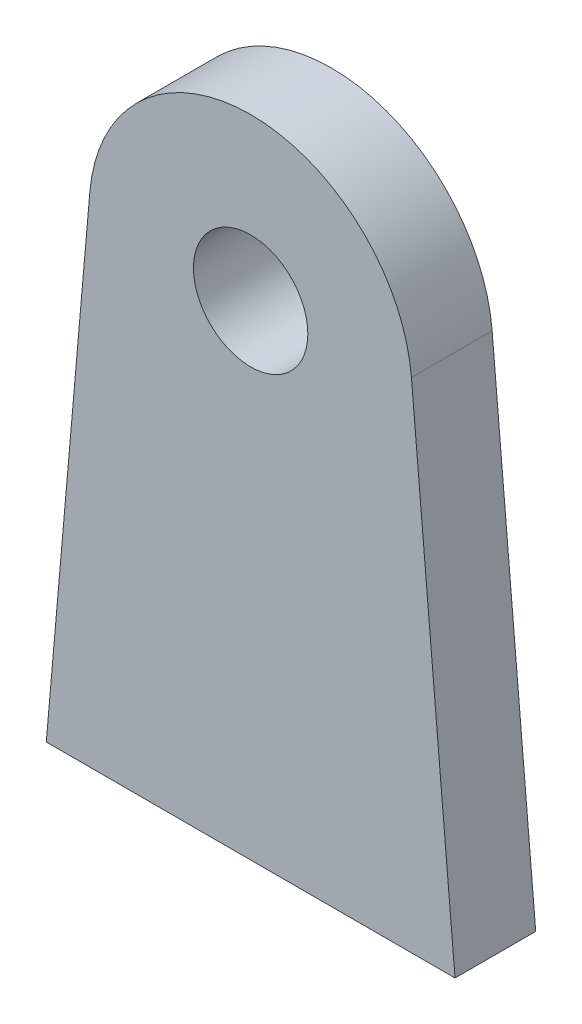
ISO-10303-21;
HEADER;
FILE_DESCRIPTION(('STEP AP214'),'2;1');
FILE_NAME('part.step','',(''),(''),'','','');
FILE_SCHEMA(('AUTOMOTIVE_DESIGN { 1 0 10303 214 1 1 1 1 }'));
ENDSEC;
DATA;
#1=APPLICATION_CONTEXT('core data for automotive mechanical design processes');
#2=APPLICATION_PROTOCOL_DEFINITION('international standard','automotive_design',2000,#1);
#3=PRODUCT_CONTEXT('',#1,'mechanical');
#4=PRODUCT('Part','Part','',(#3));
#5=PRODUCT_RELATED_PRODUCT_CATEGORY('part','',(#4));
#6=PRODUCT_DEFINITION_FORMATION('','',#4);
#7=PRODUCT_DEFINITION_CONTEXT('part definition',#1,'design');
#8=PRODUCT_DEFINITION('design','',#6,#7);
#9=PRODUCT_DEFINITION_SHAPE('','',#8);
#10=(LENGTH_UNIT() NAMED_UNIT(*) SI_UNIT(.MILLI.,.METRE.));
#11=(NAMED_UNIT(*) PLANE_ANGLE_UNIT() SI_UNIT($,.RADIAN.));
#12=(NAMED_UNIT(*) SI_UNIT($,.STERADIAN.) SOLID_ANGLE_UNIT());
#13=UNCERTAINTY_MEASURE_WITH_UNIT(LENGTH_MEASURE(1.E-05),#10,'distance_accuracy_value','');
#14=(GEOMETRIC_REPRESENTATION_CONTEXT(3) GLOBAL_UNCERTAINTY_ASSIGNED_CONTEXT((#13)) GLOBAL_UNIT_ASSIGNED_CONTEXT((#10,
#11,#12)) REPRESENTATION_CONTEXT('',''));
#15=CARTESIAN_POINT('',(0.,0.,0.));
#16=DIRECTION('',(0.,0.,1.));
#17=DIRECTION('',(1.,0.,0.));
#18=AXIS2_PLACEMENT_3D('',#15,#16,#17);
#19=CARTESIAN_POINT('',(0.,0.,3.175));
#20=DIRECTION('',(0.996194698091746,-0.0871557427476583,0.));
#21=DIRECTION('',(0.0871557427476583,0.996194698091746,0.));
#22=AXIS2_PLACEMENT_3D('',#19,#20,#21);
#23=PLANE('',#22);
#24=DIRECTION('',(-0.0871557427476583,-0.996194698091746,0.));
#25=VECTOR('',#24,1.);
#26=CARTESIAN_POINT('',(0.,0.,0.));
#27=LINE('',#26,#25);
#28=CARTESIAN_POINT('',(1.71507867568653,19.6034389664476,0.));
#29=VERTEX_POINT('',#28);
#30=CARTESIAN_POINT('',(0.,0.,0.));
#31=VERTEX_POINT('',#30);
#32=EDGE_CURVE('E99',#29,#31,#27,.T.);
#33=ORIENTED_EDGE('',*,*,#32,.T.);
#34=DIRECTION('',(0.,0.,-1.));
#35=VECTOR('',#34,1.);
#36=CARTESIAN_POINT('',(0.,0.,3.175));
#37=LINE('',#36,#35);
#38=CARTESIAN_POINT('',(0.,0.,3.175));
#39=VERTEX_POINT('',#38);
#40=EDGE_CURVE('E11',#39,#31,#37,.T.);
#41=ORIENTED_EDGE('',*,*,#40,.F.);
#42=DIRECTION('',(-0.0871557427476583,-0.996194698091746,0.));
#43=VECTOR('',#42,1.);
#44=CARTESIAN_POINT('',(0.,0.,3.175));
#45=LINE('',#44,#43);
#46=CARTESIAN_POINT('',(1.71507867568653,19.6034389664476,3.175));
#47=VERTEX_POINT('',#46);
#48=EDGE_CURVE('E87',#47,#39,#45,.T.);
#49=ORIENTED_EDGE('',*,*,#48,.F.);
#50=DIRECTION('',(0.,0.,-1.));
#51=VECTOR('',#50,1.);
#52=CARTESIAN_POINT('',(1.71507867568653,19.6034389664476,3.175));
#53=LINE('',#52,#51);
#54=EDGE_CURVE('E95',#47,#29,#53,.T.);
#55=ORIENTED_EDGE('',*,*,#54,.T.);
#56=EDGE_LOOP('',(#33,#41,#49,#55));
#57=FACE_BOUND('',#56,.T.);
#58=ADVANCED_FACE('F36',(#57),#23,.F.);
#59=CARTESIAN_POINT('',(0.,0.,3.175));
#60=DIRECTION('',(0.,1.,0.));
#61=DIRECTION('',(0.,0.,1.));
#62=AXIS2_PLACEMENT_3D('',#59,#60,#61);
#63=PLANE('',#62);
#64=DIRECTION('',(1.,0.,0.));
#65=VECTOR('',#64,1.);
#66=CARTESIAN_POINT('',(0.,0.,0.));
#67=LINE('',#66,#65);
#68=CARTESIAN_POINT('',(16.0818300171382,0.,0.));
#69=VERTEX_POINT('',#68);
#70=EDGE_CURVE('E91',#31,#69,#67,.T.);
#71=ORIENTED_EDGE('',*,*,#70,.T.);
#72=DIRECTION('',(0.,0.,-1.));
#73=VECTOR('',#72,1.);
#74=CARTESIAN_POINT('',(16.0818300171382,0.,3.175));
#75=LINE('',#74,#73);
#76=CARTESIAN_POINT('',(16.0818300171382,0.,3.175));
#77=VERTEX_POINT('',#76);
#78=EDGE_CURVE('E44',#77,#69,#75,.T.);
#79=ORIENTED_EDGE('',*,*,#78,.F.);
#80=DIRECTION('',(1.,0.,0.));
#81=VECTOR('',#80,1.);
#82=CARTESIAN_POINT('',(0.,0.,3.175));
#83=LINE('',#82,#81);
#84=EDGE_CURVE('E82',#39,#77,#83,.T.);
#85=ORIENTED_EDGE('',*,*,#84,.F.);
#86=ORIENTED_EDGE('',*,*,#40,.T.);
#87=EDGE_LOOP('',(#71,#79,#85,#86));
#88=FACE_BOUND('',#87,.T.);
#89=ADVANCED_FACE('F90',(#88),#63,.F.);
#90=CARTESIAN_POINT('',(16.0818300171382,0.,3.175));
#91=DIRECTION('',(-0.996194698091746,-0.0871557427476583,0.));
#92=DIRECTION('',(0.0871557427476583,-0.996194698091746,0.));
#93=AXIS2_PLACEMENT_3D('',#90,#91,#92);
#94=PLANE('',#93);
#95=DIRECTION('',(-0.0871557427476583,0.996194698091746,0.));
#96=VECTOR('',#95,1.);
#97=CARTESIAN_POINT('',(16.0818300171382,0.,0.));
#98=LINE('',#97,#96);
#99=CARTESIAN_POINT('',(14.3667513414517,19.6034389664476,0.));
#100=VERTEX_POINT('',#99);
#101=EDGE_CURVE('E69',#69,#100,#98,.T.);
#102=ORIENTED_EDGE('',*,*,#101,.T.);
#103=DIRECTION('',(0.,0.,-1.));
#104=VECTOR('',#103,1.);
#105=CARTESIAN_POINT('',(14.3667513414517,19.6034389664476,3.175));
#106=LINE('',#105,#104);
#107=CARTESIAN_POINT('',(14.3667513414517,19.6034389664476,3.175));
#108=VERTEX_POINT('',#107);
#109=EDGE_CURVE('E92',#108,#100,#106,.T.);
#110=ORIENTED_EDGE('',*,*,#109,.F.);
#111=DIRECTION('',(-0.0871557427476583,0.996194698091746,0.));
#112=VECTOR('',#111,1.);
#113=CARTESIAN_POINT('',(16.0818300171382,0.,3.175));
#114=LINE('',#113,#112);
#115=EDGE_CURVE('E85',#77,#108,#114,.T.);
#116=ORIENTED_EDGE('',*,*,#115,.F.);
#117=ORIENTED_EDGE('',*,*,#78,.T.);
#118=EDGE_LOOP('',(#102,#110,#116,#117));
#119=FACE_BOUND('',#118,.T.);
#120=ADVANCED_FACE('F93',(#119),#94,.F.);
#121=CARTESIAN_POINT('',(8.04091500856911,19.05,3.175));
#122=DIRECTION('',(0.,0.,-1.));
#123=DIRECTION('',(-1.,0.,0.));
#124=AXIS2_PLACEMENT_3D('',#121,#122,#123);
#125=CYLINDRICAL_SURFACE('',#124,6.35);
#126=CARTESIAN_POINT('',(8.04091500856911,19.05,0.));
#127=DIRECTION('',(0.,0.,1.));
#128=DIRECTION('',(1.,0.,0.));
#129=AXIS2_PLACEMENT_3D('',#126,#127,#128);
#130=CIRCLE('',#129,6.35);
#131=EDGE_CURVE('E75',#100,#29,#130,.T.);
#132=ORIENTED_EDGE('',*,*,#131,.T.);
#133=ORIENTED_EDGE('',*,*,#54,.F.);
#134=CARTESIAN_POINT('',(8.04091500856911,19.05,3.175));
#135=DIRECTION('',(0.,0.,1.));
#136=DIRECTION('',(1.,0.,0.));
#137=AXIS2_PLACEMENT_3D('',#134,#135,#136);
#138=CIRCLE('',#137,6.35);
#139=EDGE_CURVE('E52',#108,#47,#138,.T.);
#140=ORIENTED_EDGE('',*,*,#139,.F.);
#141=ORIENTED_EDGE('',*,*,#109,.T.);
#142=EDGE_LOOP('',(#132,#133,#140,#141));
#143=FACE_BOUND('',#142,.T.);
#144=ADVANCED_FACE('F107',(#143),#125,.T.);
#145=CARTESIAN_POINT('',(8.04091500856911,19.05,3.175));
#146=DIRECTION('',(0.,0.,1.));
#147=DIRECTION('',(1.,0.,0.));
#148=AXIS2_PLACEMENT_3D('',#145,#146,#147);
#149=PLANE('',#148);
#150=CARTESIAN_POINT('',(8.04091500856911,19.05,3.175));
#151=DIRECTION('',(0.,0.,1.));
#152=DIRECTION('',(1.,0.,0.));
#153=AXIS2_PLACEMENT_3D('',#150,#151,#152);
#154=CIRCLE('',#153,2.25);
#155=CARTESIAN_POINT('',(10.2909150085691,19.05,3.175));
#156=VERTEX_POINT('',#155);
#157=EDGE_CURVE('E115',#156,#156,#154,.T.);
#158=ORIENTED_EDGE('',*,*,#157,.F.);
#159=EDGE_LOOP('',(#158));
#160=FACE_BOUND('',#159,.T.);
#161=ORIENTED_EDGE('',*,*,#48,.T.);
#162=ORIENTED_EDGE('',*,*,#84,.T.);
#163=ORIENTED_EDGE('',*,*,#115,.T.);
#164=ORIENTED_EDGE('',*,*,#139,.T.);
#165=EDGE_LOOP('',(#161,#162,#163,#164));
#166=FACE_BOUND('',#165,.T.);
#167=ADVANCED_FACE('F83',(#160,#166),#149,.T.);
#168=CARTESIAN_POINT('',(8.04091500856911,19.05,0.));
#169=DIRECTION('',(0.,0.,1.));
#170=DIRECTION('',(1.,0.,0.));
#171=AXIS2_PLACEMENT_3D('',#168,#169,#170);
#172=PLANE('',#171);
#173=CARTESIAN_POINT('',(8.04091500856911,19.05,0.));
#174=DIRECTION('',(0.,0.,1.));
#175=DIRECTION('',(1.,0.,0.));
#176=AXIS2_PLACEMENT_3D('',#173,#174,#175);
#177=CIRCLE('',#176,2.25);
#178=CARTESIAN_POINT('',(10.2909150085691,19.05,0.));
#179=VERTEX_POINT('',#178);
#180=EDGE_CURVE('E102',#179,#179,#177,.T.);
#181=ORIENTED_EDGE('',*,*,#180,.T.);
#182=EDGE_LOOP('',(#181));
#183=FACE_BOUND('',#182,.T.);
#184=ORIENTED_EDGE('',*,*,#32,.F.);
#185=ORIENTED_EDGE('',*,*,#131,.F.);
#186=ORIENTED_EDGE('',*,*,#101,.F.);
#187=ORIENTED_EDGE('',*,*,#70,.F.);
#188=EDGE_LOOP('',(#184,#185,#186,#187));
#189=FACE_BOUND('',#188,.T.);
#190=ADVANCED_FACE('F110',(#183,#189),#172,.F.);
#191=CARTESIAN_POINT('',(8.04091500856911,19.05,3.175));
#192=DIRECTION('',(0.,0.,1.));
#193=DIRECTION('',(1.,0.,0.));
#194=AXIS2_PLACEMENT_3D('',#191,#192,#193);
#195=CYLINDRICAL_SURFACE('',#194,2.25);
#196=ORIENTED_EDGE('',*,*,#157,.T.);
#197=EDGE_LOOP('',(#196));
#198=FACE_BOUND('',#197,.T.);
#199=ORIENTED_EDGE('',*,*,#180,.F.);
#200=EDGE_LOOP('',(#199));
#201=FACE_BOUND('',#200,.T.);
#202=ADVANCED_FACE('F119',(#198,#201),#195,.F.);
#203=CLOSED_SHELL('',(#58,#89,#120,#144,#167,#190,#202));
#204=MANIFOLD_SOLID_BREP('B2',#203);
#205=ADVANCED_BREP_SHAPE_REPRESENTATION('',(#18,#204),#14);
#206=SHAPE_DEFINITION_REPRESENTATION(#9,#205);
ENDSEC;
END-ISO-10303-21;
